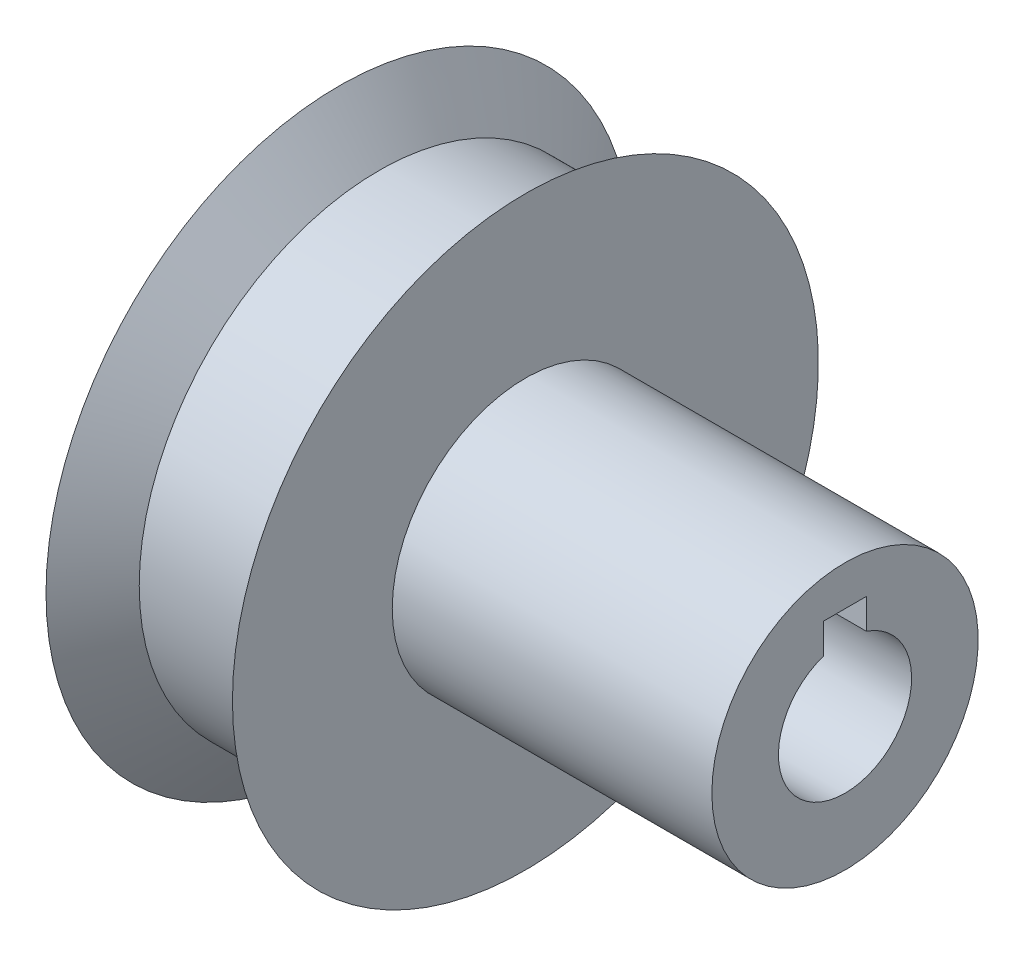
ISO-10303-21;
HEADER;
FILE_DESCRIPTION(('STEP AP214'),'2;1');
FILE_NAME('part.step','',(''),(''),'','','');
FILE_SCHEMA(('AUTOMOTIVE_DESIGN { 1 0 10303 214 1 1 1 1 }'));
ENDSEC;
DATA;
#1=APPLICATION_CONTEXT('core data for automotive mechanical design processes');
#2=APPLICATION_PROTOCOL_DEFINITION('international standard','automotive_design',2000,#1);
#3=PRODUCT_CONTEXT('',#1,'mechanical');
#4=PRODUCT('Part','Part','',(#3));
#5=PRODUCT_RELATED_PRODUCT_CATEGORY('part','',(#4));
#6=PRODUCT_DEFINITION_FORMATION('','',#4);
#7=PRODUCT_DEFINITION_CONTEXT('part definition',#1,'design');
#8=PRODUCT_DEFINITION('design','',#6,#7);
#9=PRODUCT_DEFINITION_SHAPE('','',#8);
#10=(LENGTH_UNIT() NAMED_UNIT(*) SI_UNIT(.MILLI.,.METRE.));
#11=(NAMED_UNIT(*) PLANE_ANGLE_UNIT() SI_UNIT($,.RADIAN.));
#12=(NAMED_UNIT(*) SI_UNIT($,.STERADIAN.) SOLID_ANGLE_UNIT());
#13=UNCERTAINTY_MEASURE_WITH_UNIT(LENGTH_MEASURE(1.E-05),#10,'distance_accuracy_value','');
#14=(GEOMETRIC_REPRESENTATION_CONTEXT(3) GLOBAL_UNCERTAINTY_ASSIGNED_CONTEXT((#13)) GLOBAL_UNIT_ASSIGNED_CONTEXT((#10,
#11,#12)) REPRESENTATION_CONTEXT('',''));
#15=CARTESIAN_POINT('',(0.,0.,0.));
#16=DIRECTION('',(0.,0.,1.));
#17=DIRECTION('',(1.,0.,0.));
#18=AXIS2_PLACEMENT_3D('',#15,#16,#17);
#19=CARTESIAN_POINT('',(0.,0.,-55.));
#20=DIRECTION('',(1.,0.,0.));
#21=DIRECTION('',(0.,0.,-1.));
#22=AXIS2_PLACEMENT_3D('',#19,#20,#21);
#23=PLANE('',#22);
#24=CARTESIAN_POINT('',(0.,0.,0.));
#25=DIRECTION('',(-1.,0.,0.));
#26=DIRECTION('',(0.,0.,1.));
#27=AXIS2_PLACEMENT_3D('',#24,#25,#26);
#28=CIRCLE('',#27,40.);
#29=CARTESIAN_POINT('',(0.,0.,40.));
#30=VERTEX_POINT('',#29);
#31=EDGE_CURVE('E41',#30,#30,#28,.T.);
#32=ORIENTED_EDGE('',*,*,#31,.F.);
#33=EDGE_LOOP('',(#32));
#34=FACE_BOUND('',#33,.T.);
#35=CARTESIAN_POINT('',(0.,0.,0.));
#36=DIRECTION('',(-1.,0.,0.));
#37=DIRECTION('',(0.,0.,1.));
#38=AXIS2_PLACEMENT_3D('',#35,#36,#37);
#39=CIRCLE('',#38,55.);
#40=CARTESIAN_POINT('',(0.,0.,55.));
#41=VERTEX_POINT('',#40);
#42=EDGE_CURVE('E102',#41,#41,#39,.T.);
#43=ORIENTED_EDGE('',*,*,#42,.T.);
#44=EDGE_LOOP('',(#43));
#45=FACE_BOUND('',#44,.T.);
#46=ADVANCED_FACE('F34',(#34,#45),#23,.F.);
#47=CARTESIAN_POINT('',(0.,0.,0.));
#48=DIRECTION('',(-1.,0.,0.));
#49=DIRECTION('',(0.,0.,1.));
#50=AXIS2_PLACEMENT_3D('',#47,#48,#49);
#51=CYLINDRICAL_SURFACE('',#50,40.);
#52=CARTESIAN_POINT('',(25.,0.,0.));
#53=DIRECTION('',(-1.,0.,0.));
#54=DIRECTION('',(0.,0.,1.));
#55=AXIS2_PLACEMENT_3D('',#52,#53,#54);
#56=CIRCLE('',#55,40.);
#57=CARTESIAN_POINT('',(25.,0.,40.));
#58=VERTEX_POINT('',#57);
#59=EDGE_CURVE('E131',#58,#58,#56,.T.);
#60=ORIENTED_EDGE('',*,*,#59,.F.);
#61=EDGE_LOOP('',(#60));
#62=FACE_BOUND('',#61,.T.);
#63=ORIENTED_EDGE('',*,*,#31,.T.);
#64=EDGE_LOOP('',(#63));
#65=FACE_BOUND('',#64,.T.);
#66=ADVANCED_FACE('F136',(#62,#65),#51,.F.);
#67=CARTESIAN_POINT('',(25.,0.,-40.));
#68=DIRECTION('',(1.,0.,0.));
#69=DIRECTION('',(0.,0.,-1.));
#70=AXIS2_PLACEMENT_3D('',#67,#68,#69);
#71=PLANE('',#70);
#72=CARTESIAN_POINT('',(25.,0.,0.));
#73=DIRECTION('',(-1.,0.,0.));
#74=DIRECTION('',(0.,0.,1.));
#75=AXIS2_PLACEMENT_3D('',#72,#73,#74);
#76=CIRCLE('',#75,20.);
#77=CARTESIAN_POINT('',(25.,0.,20.));
#78=VERTEX_POINT('',#77);
#79=EDGE_CURVE('E128',#78,#78,#76,.T.);
#80=ORIENTED_EDGE('',*,*,#79,.F.);
#81=EDGE_LOOP('',(#80));
#82=FACE_BOUND('',#81,.T.);
#83=ORIENTED_EDGE('',*,*,#59,.T.);
#84=EDGE_LOOP('',(#83));
#85=FACE_BOUND('',#84,.T.);
#86=ADVANCED_FACE('F189',(#82,#85),#71,.F.);
#87=CARTESIAN_POINT('',(0.,0.,0.));
#88=DIRECTION('',(-1.,0.,0.));
#89=DIRECTION('',(0.,0.,1.));
#90=AXIS2_PLACEMENT_3D('',#87,#88,#89);
#91=CYLINDRICAL_SURFACE('',#90,20.);
#92=CARTESIAN_POINT('',(50.,0.,0.));
#93=DIRECTION('',(-1.,0.,0.));
#94=DIRECTION('',(0.,0.,1.));
#95=AXIS2_PLACEMENT_3D('',#92,#93,#94);
#96=CIRCLE('',#95,20.);
#97=CARTESIAN_POINT('',(50.,0.,20.));
#98=VERTEX_POINT('',#97);
#99=EDGE_CURVE('E125',#98,#98,#96,.T.);
#100=ORIENTED_EDGE('',*,*,#99,.F.);
#101=EDGE_LOOP('',(#100));
#102=FACE_BOUND('',#101,.T.);
#103=ORIENTED_EDGE('',*,*,#79,.T.);
#104=EDGE_LOOP('',(#103));
#105=FACE_BOUND('',#104,.T.);
#106=ADVANCED_FACE('F185',(#102,#105),#91,.F.);
#107=CARTESIAN_POINT('',(50.,0.,-12.5));
#108=DIRECTION('',(1.,0.,0.));
#109=DIRECTION('',(0.,0.,-1.));
#110=AXIS2_PLACEMENT_3D('',#107,#108,#109);
#111=PLANE('',#110);
#112=DIRECTION('',(0.,0.,1.));
#113=VECTOR('',#112,1.);
#114=CARTESIAN_POINT('',(50.,17.5,-12.5));
#115=LINE('',#114,#113);
#116=CARTESIAN_POINT('',(50.,17.5,-4.));
#117=VERTEX_POINT('',#116);
#118=CARTESIAN_POINT('',(50.,17.5,4.));
#119=VERTEX_POINT('',#118);
#120=EDGE_CURVE('E81',#117,#119,#115,.T.);
#121=ORIENTED_EDGE('',*,*,#120,.T.);
#122=DIRECTION('',(0.,-1.,0.));
#123=VECTOR('',#122,1.);
#124=CARTESIAN_POINT('',(50.,0.,4.));
#125=LINE('',#124,#123);
#126=CARTESIAN_POINT('',(50.,11.842719282327,4.));
#127=VERTEX_POINT('',#126);
#128=EDGE_CURVE('E100',#119,#127,#125,.T.);
#129=ORIENTED_EDGE('',*,*,#128,.T.);
#130=CARTESIAN_POINT('',(50.,0.,0.));
#131=DIRECTION('',(-1.,0.,0.));
#132=DIRECTION('',(0.,0.,1.));
#133=AXIS2_PLACEMENT_3D('',#130,#131,#132);
#134=CIRCLE('',#133,12.5);
#135=CARTESIAN_POINT('',(50.,11.842719282327,-4.));
#136=VERTEX_POINT('',#135);
#137=EDGE_CURVE('E122',#136,#127,#134,.T.);
#138=ORIENTED_EDGE('',*,*,#137,.F.);
#139=DIRECTION('',(0.,1.,0.));
#140=VECTOR('',#139,1.);
#141=CARTESIAN_POINT('',(50.,0.,-4.));
#142=LINE('',#141,#140);
#143=EDGE_CURVE('E96',#136,#117,#142,.T.);
#144=ORIENTED_EDGE('',*,*,#143,.T.);
#145=EDGE_LOOP('',(#121,#129,#138,#144));
#146=FACE_BOUND('',#145,.T.);
#147=ORIENTED_EDGE('',*,*,#99,.T.);
#148=EDGE_LOOP('',(#147));
#149=FACE_BOUND('',#148,.T.);
#150=ADVANCED_FACE('F179',(#146,#149),#111,.F.);
#151=CARTESIAN_POINT('',(0.,0.,0.));
#152=DIRECTION('',(-1.,0.,0.));
#153=DIRECTION('',(0.,0.,1.));
#154=AXIS2_PLACEMENT_3D('',#151,#152,#153);
#155=CYLINDRICAL_SURFACE('',#154,12.5);
#156=ORIENTED_EDGE('',*,*,#137,.T.);
#157=DIRECTION('',(-1.,0.,0.));
#158=VECTOR('',#157,1.);
#159=CARTESIAN_POINT('',(0.,11.842719282327,4.));
#160=LINE('',#159,#158);
#161=CARTESIAN_POINT('',(95.,11.842719282327,4.));
#162=VERTEX_POINT('',#161);
#163=EDGE_CURVE('E55',#127,#162,#160,.F.);
#164=ORIENTED_EDGE('',*,*,#163,.T.);
#165=CARTESIAN_POINT('',(95.,0.,0.));
#166=DIRECTION('',(-1.,0.,0.));
#167=DIRECTION('',(0.,0.,1.));
#168=AXIS2_PLACEMENT_3D('',#165,#166,#167);
#169=CIRCLE('',#168,12.5);
#170=CARTESIAN_POINT('',(95.,11.842719282327,-4.));
#171=VERTEX_POINT('',#170);
#172=EDGE_CURVE('E120',#171,#162,#169,.T.);
#173=ORIENTED_EDGE('',*,*,#172,.F.);
#174=DIRECTION('',(-1.,0.,0.));
#175=VECTOR('',#174,1.);
#176=CARTESIAN_POINT('',(0.,11.842719282327,-4.));
#177=LINE('',#176,#175);
#178=EDGE_CURVE('E48',#171,#136,#177,.T.);
#179=ORIENTED_EDGE('',*,*,#178,.T.);
#180=EDGE_LOOP('',(#156,#164,#173,#179));
#181=FACE_BOUND('',#180,.T.);
#182=ADVANCED_FACE('F174',(#181),#155,.F.);
#183=CARTESIAN_POINT('',(95.,0.,-12.5));
#184=DIRECTION('',(-1.,0.,0.));
#185=DIRECTION('',(0.,0.,1.));
#186=AXIS2_PLACEMENT_3D('',#183,#184,#185);
#187=PLANE('',#186);
#188=CARTESIAN_POINT('',(95.,0.,0.));
#189=DIRECTION('',(-1.,0.,0.));
#190=DIRECTION('',(0.,0.,1.));
#191=AXIS2_PLACEMENT_3D('',#188,#189,#190);
#192=CIRCLE('',#191,25.);
#193=CARTESIAN_POINT('',(95.,0.,25.));
#194=VERTEX_POINT('',#193);
#195=EDGE_CURVE('E117',#194,#194,#192,.T.);
#196=ORIENTED_EDGE('',*,*,#195,.F.);
#197=EDGE_LOOP('',(#196));
#198=FACE_BOUND('',#197,.T.);
#199=ORIENTED_EDGE('',*,*,#172,.T.);
#200=DIRECTION('',(0.,-1.,0.));
#201=VECTOR('',#200,1.);
#202=CARTESIAN_POINT('',(95.,10.1184929043091,4.));
#203=LINE('',#202,#201);
#204=CARTESIAN_POINT('',(95.,17.5,4.));
#205=VERTEX_POINT('',#204);
#206=EDGE_CURVE('E90',#205,#162,#203,.T.);
#207=ORIENTED_EDGE('',*,*,#206,.F.);
#208=DIRECTION('',(0.,0.,1.));
#209=VECTOR('',#208,1.);
#210=CARTESIAN_POINT('',(95.,17.5,0.));
#211=LINE('',#210,#209);
#212=CARTESIAN_POINT('',(95.,17.5,-4.));
#213=VERTEX_POINT('',#212);
#214=EDGE_CURVE('E78',#213,#205,#211,.T.);
#215=ORIENTED_EDGE('',*,*,#214,.F.);
#216=DIRECTION('',(0.,-1.,0.));
#217=VECTOR('',#216,1.);
#218=CARTESIAN_POINT('',(95.,0.,-4.));
#219=LINE('',#218,#217);
#220=EDGE_CURVE('E11',#213,#171,#219,.T.);
#221=ORIENTED_EDGE('',*,*,#220,.T.);
#222=EDGE_LOOP('',(#199,#207,#215,#221));
#223=FACE_BOUND('',#222,.T.);
#224=ADVANCED_FACE('F89',(#198,#223),#187,.F.);
#225=CARTESIAN_POINT('',(0.,0.,0.));
#226=DIRECTION('',(-1.,0.,0.));
#227=DIRECTION('',(0.,0.,1.));
#228=AXIS2_PLACEMENT_3D('',#225,#226,#227);
#229=CYLINDRICAL_SURFACE('',#228,25.);
#230=CARTESIAN_POINT('',(35.,0.,0.));
#231=DIRECTION('',(-1.,0.,0.));
#232=DIRECTION('',(0.,0.,1.));
#233=AXIS2_PLACEMENT_3D('',#230,#231,#232);
#234=CIRCLE('',#233,25.);
#235=CARTESIAN_POINT('',(35.,0.,25.));
#236=VERTEX_POINT('',#235);
#237=EDGE_CURVE('E114',#236,#236,#234,.T.);
#238=ORIENTED_EDGE('',*,*,#237,.F.);
#239=EDGE_LOOP('',(#238));
#240=FACE_BOUND('',#239,.T.);
#241=ORIENTED_EDGE('',*,*,#195,.T.);
#242=EDGE_LOOP('',(#241));
#243=FACE_BOUND('',#242,.T.);
#244=ADVANCED_FACE('F164',(#240,#243),#229,.T.);
#245=CARTESIAN_POINT('',(35.,0.,-25.));
#246=DIRECTION('',(-1.,0.,0.));
#247=DIRECTION('',(0.,0.,1.));
#248=AXIS2_PLACEMENT_3D('',#245,#246,#247);
#249=PLANE('',#248);
#250=CARTESIAN_POINT('',(35.,0.,0.));
#251=DIRECTION('',(-1.,0.,0.));
#252=DIRECTION('',(0.,0.,1.));
#253=AXIS2_PLACEMENT_3D('',#250,#251,#252);
#254=CIRCLE('',#253,55.);
#255=CARTESIAN_POINT('',(35.,0.,55.));
#256=VERTEX_POINT('',#255);
#257=EDGE_CURVE('E111',#256,#256,#254,.T.);
#258=ORIENTED_EDGE('',*,*,#257,.F.);
#259=EDGE_LOOP('',(#258));
#260=FACE_BOUND('',#259,.T.);
#261=ORIENTED_EDGE('',*,*,#237,.T.);
#262=EDGE_LOOP('',(#261));
#263=FACE_BOUND('',#262,.T.);
#264=ADVANCED_FACE('F158',(#260,#263),#249,.F.);
#265=CARTESIAN_POINT('',(35.,0.,0.));
#266=DIRECTION('',(1.,0.,0.));
#267=DIRECTION('',(0.,0.,-1.));
#268=AXIS2_PLACEMENT_3D('',#265,#266,#267);
#269=CONICAL_SURFACE('',#268,55.,0.964136356135725);
#270=CARTESIAN_POINT('',(28.0604116959888,0.,0.));
#271=DIRECTION('',(-1.,0.,0.));
#272=DIRECTION('',(0.,0.,1.));
#273=AXIS2_PLACEMENT_3D('',#270,#271,#272);
#274=CIRCLE('',#273,45.);
#275=CARTESIAN_POINT('',(28.0604116959888,0.,45.));
#276=VERTEX_POINT('',#275);
#277=EDGE_CURVE('E108',#276,#276,#274,.T.);
#278=ORIENTED_EDGE('',*,*,#277,.F.);
#279=EDGE_LOOP('',(#278));
#280=FACE_BOUND('',#279,.T.);
#281=ORIENTED_EDGE('',*,*,#257,.T.);
#282=EDGE_LOOP('',(#281));
#283=FACE_BOUND('',#282,.T.);
#284=ADVANCED_FACE('F152',(#280,#283),#269,.T.);
#285=CARTESIAN_POINT('',(0.,0.,0.));
#286=DIRECTION('',(-1.,0.,0.));
#287=DIRECTION('',(0.,0.,1.));
#288=AXIS2_PLACEMENT_3D('',#285,#286,#287);
#289=CYLINDRICAL_SURFACE('',#288,45.);
#290=CARTESIAN_POINT('',(7.5,0.,0.));
#291=DIRECTION('',(-1.,0.,0.));
#292=DIRECTION('',(0.,0.,1.));
#293=AXIS2_PLACEMENT_3D('',#290,#291,#292);
#294=CIRCLE('',#293,45.);
#295=CARTESIAN_POINT('',(7.5,0.,45.));
#296=VERTEX_POINT('',#295);
#297=EDGE_CURVE('E105',#296,#296,#294,.T.);
#298=ORIENTED_EDGE('',*,*,#297,.F.);
#299=EDGE_LOOP('',(#298));
#300=FACE_BOUND('',#299,.T.);
#301=ORIENTED_EDGE('',*,*,#277,.T.);
#302=EDGE_LOOP('',(#301));
#303=FACE_BOUND('',#302,.T.);
#304=ADVANCED_FACE('F146',(#300,#303),#289,.T.);
#305=CARTESIAN_POINT('',(7.5,0.,0.));
#306=DIRECTION('',(-1.,0.,0.));
#307=DIRECTION('',(0.,0.,1.));
#308=AXIS2_PLACEMENT_3D('',#305,#306,#307);
#309=CONICAL_SURFACE('',#308,45.,0.927295218001612);
#310=ORIENTED_EDGE('',*,*,#42,.F.);
#311=EDGE_LOOP('',(#310));
#312=FACE_BOUND('',#311,.T.);
#313=ORIENTED_EDGE('',*,*,#297,.T.);
#314=EDGE_LOOP('',(#313));
#315=FACE_BOUND('',#314,.T.);
#316=ADVANCED_FACE('F142',(#312,#315),#309,.T.);
#317=CARTESIAN_POINT('',(0.,10.1184929043091,4.));
#318=DIRECTION('',(0.,0.,1.));
#319=DIRECTION('',(1.,0.,0.));
#320=AXIS2_PLACEMENT_3D('',#317,#318,#319);
#321=PLANE('',#320);
#322=DIRECTION('',(1.,0.,0.));
#323=VECTOR('',#322,1.);
#324=CARTESIAN_POINT('',(0.,17.5,4.));
#325=LINE('',#324,#323);
#326=EDGE_CURVE('E83',#119,#205,#325,.T.);
#327=ORIENTED_EDGE('',*,*,#326,.T.);
#328=ORIENTED_EDGE('',*,*,#206,.T.);
#329=ORIENTED_EDGE('',*,*,#163,.F.);
#330=ORIENTED_EDGE('',*,*,#128,.F.);
#331=EDGE_LOOP('',(#327,#328,#329,#330));
#332=FACE_BOUND('',#331,.T.);
#333=ADVANCED_FACE('F145',(#332),#321,.F.);
#334=CARTESIAN_POINT('',(0.,17.5,0.));
#335=DIRECTION('',(0.,1.,0.));
#336=DIRECTION('',(0.,0.,1.));
#337=AXIS2_PLACEMENT_3D('',#334,#335,#336);
#338=PLANE('',#337);
#339=DIRECTION('',(1.,0.,0.));
#340=VECTOR('',#339,1.);
#341=CARTESIAN_POINT('',(0.,17.5,-4.));
#342=LINE('',#341,#340);
#343=EDGE_CURVE('E74',#117,#213,#342,.T.);
#344=ORIENTED_EDGE('',*,*,#343,.T.);
#345=ORIENTED_EDGE('',*,*,#214,.T.);
#346=ORIENTED_EDGE('',*,*,#326,.F.);
#347=ORIENTED_EDGE('',*,*,#120,.F.);
#348=EDGE_LOOP('',(#344,#345,#346,#347));
#349=FACE_BOUND('',#348,.T.);
#350=ADVANCED_FACE('F75',(#349),#338,.F.);
#351=CARTESIAN_POINT('',(0.,17.5,-4.));
#352=DIRECTION('',(0.,0.,-1.));
#353=DIRECTION('',(-1.,0.,0.));
#354=AXIS2_PLACEMENT_3D('',#351,#352,#353);
#355=PLANE('',#354);
#356=ORIENTED_EDGE('',*,*,#178,.F.);
#357=ORIENTED_EDGE('',*,*,#220,.F.);
#358=ORIENTED_EDGE('',*,*,#343,.F.);
#359=ORIENTED_EDGE('',*,*,#143,.F.);
#360=EDGE_LOOP('',(#356,#357,#358,#359));
#361=FACE_BOUND('',#360,.T.);
#362=ADVANCED_FACE('F85',(#361),#355,.F.);
#363=CLOSED_SHELL('',(#46,#66,#86,#106,#150,#182,#224,#244,#264,#284,#304,#316,#333,#350,#362));
#364=MANIFOLD_SOLID_BREP('B2',#363);
#365=ADVANCED_BREP_SHAPE_REPRESENTATION('',(#18,#364),#14);
#366=SHAPE_DEFINITION_REPRESENTATION(#9,#365);
ENDSEC;
END-ISO-10303-21;
